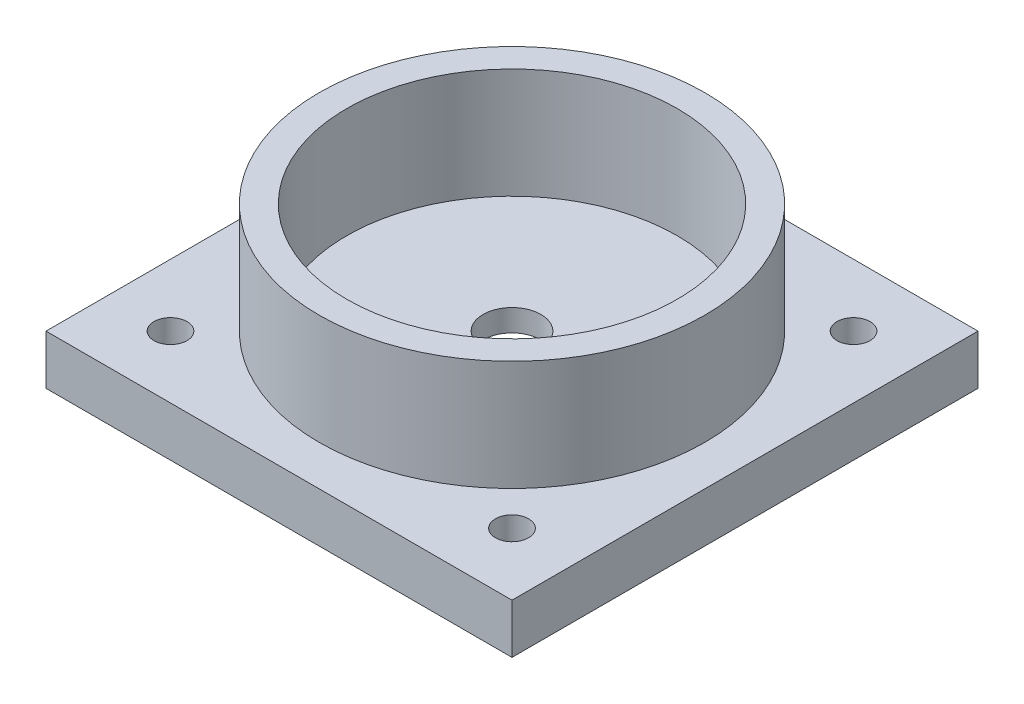
ISO-10303-21;
HEADER;
FILE_DESCRIPTION(('STEP AP214'),'2;1');
FILE_NAME('part.step','',(''),(''),'','','');
FILE_SCHEMA(('AUTOMOTIVE_DESIGN { 1 0 10303 214 1 1 1 1 }'));
ENDSEC;
DATA;
#1=APPLICATION_CONTEXT('core data for automotive mechanical design processes');
#2=APPLICATION_PROTOCOL_DEFINITION('international standard','automotive_design',2000,#1);
#3=PRODUCT_CONTEXT('',#1,'mechanical');
#4=PRODUCT('Part','Part','',(#3));
#5=PRODUCT_RELATED_PRODUCT_CATEGORY('part','',(#4));
#6=PRODUCT_DEFINITION_FORMATION('','',#4);
#7=PRODUCT_DEFINITION_CONTEXT('part definition',#1,'design');
#8=PRODUCT_DEFINITION('design','',#6,#7);
#9=PRODUCT_DEFINITION_SHAPE('','',#8);
#10=(LENGTH_UNIT() NAMED_UNIT(*) SI_UNIT(.MILLI.,.METRE.));
#11=(NAMED_UNIT(*) PLANE_ANGLE_UNIT() SI_UNIT($,.RADIAN.));
#12=(NAMED_UNIT(*) SI_UNIT($,.STERADIAN.) SOLID_ANGLE_UNIT());
#13=UNCERTAINTY_MEASURE_WITH_UNIT(LENGTH_MEASURE(1.E-05),#10,'distance_accuracy_value','');
#14=(GEOMETRIC_REPRESENTATION_CONTEXT(3) GLOBAL_UNCERTAINTY_ASSIGNED_CONTEXT((#13)) GLOBAL_UNIT_ASSIGNED_CONTEXT((#10,
#11,#12)) REPRESENTATION_CONTEXT('',''));
#15=CARTESIAN_POINT('',(0.,0.,0.));
#16=DIRECTION('',(0.,0.,1.));
#17=DIRECTION('',(1.,0.,0.));
#18=AXIS2_PLACEMENT_3D('',#15,#16,#17);
#19=CARTESIAN_POINT('',(0.,4.5,0.));
#20=DIRECTION('',(0.,-1.,0.));
#21=DIRECTION('',(0.,0.,-1.));
#22=AXIS2_PLACEMENT_3D('',#19,#20,#21);
#23=PLANE('',#22);
#24=CARTESIAN_POINT('',(0.,4.5,0.));
#25=DIRECTION('',(0.,-1.,0.));
#26=DIRECTION('',(0.,0.,-1.));
#27=AXIS2_PLACEMENT_3D('',#24,#25,#26);
#28=CIRCLE('',#27,2.625);
#29=CARTESIAN_POINT('',(0.,4.5,-2.625));
#30=VERTEX_POINT('',#29);
#31=EDGE_CURVE('E324',#30,#30,#28,.F.);
#32=ORIENTED_EDGE('',*,*,#31,.F.);
#33=EDGE_LOOP('',(#32));
#34=FACE_BOUND('',#33,.T.);
#35=CARTESIAN_POINT('',(0.,4.5,0.));
#36=DIRECTION('',(0.,1.,0.));
#37=DIRECTION('',(0.,0.,1.));
#38=AXIS2_PLACEMENT_3D('',#35,#36,#37);
#39=CIRCLE('',#38,15.);
#40=CARTESIAN_POINT('',(0.,4.5,15.));
#41=VERTEX_POINT('',#40);
#42=EDGE_CURVE('E335',#41,#41,#39,.T.);
#43=ORIENTED_EDGE('',*,*,#42,.T.);
#44=EDGE_LOOP('',(#43));
#45=FACE_BOUND('',#44,.T.);
#46=ADVANCED_FACE('F36',(#34,#45),#23,.F.);
#47=CARTESIAN_POINT('',(0.,4.5,0.));
#48=DIRECTION('',(0.,-1.,0.));
#49=DIRECTION('',(0.,0.,-1.));
#50=AXIS2_PLACEMENT_3D('',#47,#48,#49);
#51=CIRCLE('',#50,17.5);
#52=CARTESIAN_POINT('',(0.,4.5,-17.5));
#53=VERTEX_POINT('',#52);
#54=EDGE_CURVE('E11',#53,#53,#51,.F.);
#55=ORIENTED_EDGE('',*,*,#54,.F.);
#56=EDGE_LOOP('',(#55));
#57=FACE_BOUND('',#56,.T.);
#58=DIRECTION('',(0.,0.,-1.));
#59=VECTOR('',#58,1.);
#60=CARTESIAN_POINT('',(21.15,4.5,21.15));
#61=LINE('',#60,#59);
#62=CARTESIAN_POINT('',(21.15,4.5,21.15));
#63=VERTEX_POINT('',#62);
#64=CARTESIAN_POINT('',(21.15,4.5,-21.15));
#65=VERTEX_POINT('',#64);
#66=EDGE_CURVE('E90',#63,#65,#61,.T.);
#67=ORIENTED_EDGE('',*,*,#66,.T.);
#68=DIRECTION('',(-1.,0.,0.));
#69=VECTOR('',#68,1.);
#70=CARTESIAN_POINT('',(-21.15,4.5,-21.15));
#71=LINE('',#70,#69);
#72=CARTESIAN_POINT('',(-21.15,4.5,-21.15));
#73=VERTEX_POINT('',#72);
#74=EDGE_CURVE('E84',#65,#73,#71,.T.);
#75=ORIENTED_EDGE('',*,*,#74,.T.);
#76=DIRECTION('',(0.,0.,1.));
#77=VECTOR('',#76,1.);
#78=CARTESIAN_POINT('',(-21.15,4.5,21.15));
#79=LINE('',#78,#77);
#80=CARTESIAN_POINT('',(-21.15,4.5,21.15));
#81=VERTEX_POINT('',#80);
#82=EDGE_CURVE('E88',#73,#81,#79,.T.);
#83=ORIENTED_EDGE('',*,*,#82,.T.);
#84=DIRECTION('',(1.,0.,0.));
#85=VECTOR('',#84,1.);
#86=CARTESIAN_POINT('',(-21.15,4.5,21.15));
#87=LINE('',#86,#85);
#88=EDGE_CURVE('E53',#81,#63,#87,.T.);
#89=ORIENTED_EDGE('',*,*,#88,.T.);
#90=EDGE_LOOP('',(#67,#75,#83,#89));
#91=FACE_BOUND('',#90,.T.);
#92=CARTESIAN_POINT('',(-15.5,4.5,-15.5));
#93=DIRECTION('',(0.,1.,0.));
#94=DIRECTION('',(0.,0.,1.));
#95=AXIS2_PLACEMENT_3D('',#92,#93,#94);
#96=CIRCLE('',#95,1.5);
#97=CARTESIAN_POINT('',(-15.5,4.5,-14.));
#98=VERTEX_POINT('',#97);
#99=EDGE_CURVE('E107',#98,#98,#96,.T.);
#100=ORIENTED_EDGE('',*,*,#99,.F.);
#101=EDGE_LOOP('',(#100));
#102=FACE_BOUND('',#101,.T.);
#103=CARTESIAN_POINT('',(15.5,4.5,-15.5));
#104=DIRECTION('',(0.,1.,0.));
#105=DIRECTION('',(0.,0.,1.));
#106=AXIS2_PLACEMENT_3D('',#103,#104,#105);
#107=CIRCLE('',#106,1.5);
#108=CARTESIAN_POINT('',(15.5,4.5,-14.));
#109=VERTEX_POINT('',#108);
#110=EDGE_CURVE('E144',#109,#109,#107,.T.);
#111=ORIENTED_EDGE('',*,*,#110,.F.);
#112=EDGE_LOOP('',(#111));
#113=FACE_BOUND('',#112,.T.);
#114=CARTESIAN_POINT('',(-15.5,4.5,15.5));
#115=DIRECTION('',(0.,1.,0.));
#116=DIRECTION('',(0.,0.,1.));
#117=AXIS2_PLACEMENT_3D('',#114,#115,#116);
#118=CIRCLE('',#117,1.5);
#119=CARTESIAN_POINT('',(-15.5,4.5,17.));
#120=VERTEX_POINT('',#119);
#121=EDGE_CURVE('E139',#120,#120,#118,.T.);
#122=ORIENTED_EDGE('',*,*,#121,.F.);
#123=EDGE_LOOP('',(#122));
#124=FACE_BOUND('',#123,.T.);
#125=CARTESIAN_POINT('',(15.5,4.5,15.5));
#126=DIRECTION('',(0.,1.,0.));
#127=DIRECTION('',(0.,0.,1.));
#128=AXIS2_PLACEMENT_3D('',#125,#126,#127);
#129=CIRCLE('',#128,1.5);
#130=CARTESIAN_POINT('',(15.5,4.5,17.));
#131=VERTEX_POINT('',#130);
#132=EDGE_CURVE('E128',#131,#131,#129,.T.);
#133=ORIENTED_EDGE('',*,*,#132,.F.);
#134=EDGE_LOOP('',(#133));
#135=FACE_BOUND('',#134,.T.);
#136=ADVANCED_FACE('F85',(#57,#91,#102,#113,#124,#135),#23,.F.);
#137=CARTESIAN_POINT('',(0.,0.,0.));
#138=DIRECTION('',(0.,-1.,0.));
#139=DIRECTION('',(0.,0.,-1.));
#140=AXIS2_PLACEMENT_3D('',#137,#138,#139);
#141=PLANE('',#140);
#142=CARTESIAN_POINT('',(0.,0.,0.));
#143=DIRECTION('',(0.,-1.,0.));
#144=DIRECTION('',(0.,0.,-1.));
#145=AXIS2_PLACEMENT_3D('',#142,#143,#144);
#146=CIRCLE('',#145,11.);
#147=CARTESIAN_POINT('',(0.,0.,-11.));
#148=VERTEX_POINT('',#147);
#149=EDGE_CURVE('E135',#148,#148,#146,.T.);
#150=ORIENTED_EDGE('',*,*,#149,.F.);
#151=EDGE_LOOP('',(#150));
#152=FACE_BOUND('',#151,.T.);
#153=CARTESIAN_POINT('',(-15.5,0.,15.5));
#154=DIRECTION('',(0.,1.,0.));
#155=DIRECTION('',(0.,0.,1.));
#156=AXIS2_PLACEMENT_3D('',#153,#154,#155);
#157=CIRCLE('',#156,1.5);
#158=CARTESIAN_POINT('',(-15.5,0.,17.));
#159=VERTEX_POINT('',#158);
#160=EDGE_CURVE('E132',#159,#159,#157,.T.);
#161=ORIENTED_EDGE('',*,*,#160,.T.);
#162=EDGE_LOOP('',(#161));
#163=FACE_BOUND('',#162,.T.);
#164=CARTESIAN_POINT('',(-15.5,0.,-15.5));
#165=DIRECTION('',(0.,1.,0.));
#166=DIRECTION('',(0.,0.,1.));
#167=AXIS2_PLACEMENT_3D('',#164,#165,#166);
#168=CIRCLE('',#167,1.5);
#169=CARTESIAN_POINT('',(-15.5,0.,-14.));
#170=VERTEX_POINT('',#169);
#171=EDGE_CURVE('E147',#170,#170,#168,.T.);
#172=ORIENTED_EDGE('',*,*,#171,.T.);
#173=EDGE_LOOP('',(#172));
#174=FACE_BOUND('',#173,.T.);
#175=DIRECTION('',(0.,0.,-1.));
#176=VECTOR('',#175,1.);
#177=CARTESIAN_POINT('',(21.15,0.,21.15));
#178=LINE('',#177,#176);
#179=CARTESIAN_POINT('',(21.15,0.,21.15));
#180=VERTEX_POINT('',#179);
#181=CARTESIAN_POINT('',(21.15,0.,-21.15));
#182=VERTEX_POINT('',#181);
#183=EDGE_CURVE('E104',#180,#182,#178,.T.);
#184=ORIENTED_EDGE('',*,*,#183,.F.);
#185=DIRECTION('',(1.,0.,0.));
#186=VECTOR('',#185,1.);
#187=CARTESIAN_POINT('',(-21.15,0.,21.15));
#188=LINE('',#187,#186);
#189=CARTESIAN_POINT('',(-21.15,0.,21.15));
#190=VERTEX_POINT('',#189);
#191=EDGE_CURVE('E76',#190,#180,#188,.T.);
#192=ORIENTED_EDGE('',*,*,#191,.F.);
#193=DIRECTION('',(0.,0.,1.));
#194=VECTOR('',#193,1.);
#195=CARTESIAN_POINT('',(-21.15,0.,21.15));
#196=LINE('',#195,#194);
#197=CARTESIAN_POINT('',(-21.15,0.,-21.15));
#198=VERTEX_POINT('',#197);
#199=EDGE_CURVE('E70',#198,#190,#196,.T.);
#200=ORIENTED_EDGE('',*,*,#199,.F.);
#201=DIRECTION('',(-1.,0.,0.));
#202=VECTOR('',#201,1.);
#203=CARTESIAN_POINT('',(-21.15,0.,-21.15));
#204=LINE('',#203,#202);
#205=EDGE_CURVE('E95',#182,#198,#204,.T.);
#206=ORIENTED_EDGE('',*,*,#205,.F.);
#207=EDGE_LOOP('',(#184,#192,#200,#206));
#208=FACE_BOUND('',#207,.T.);
#209=CARTESIAN_POINT('',(15.5,0.,-15.5));
#210=DIRECTION('',(0.,1.,0.));
#211=DIRECTION('',(0.,0.,1.));
#212=AXIS2_PLACEMENT_3D('',#209,#210,#211);
#213=CIRCLE('',#212,1.5);
#214=CARTESIAN_POINT('',(15.5,0.,-14.));
#215=VERTEX_POINT('',#214);
#216=EDGE_CURVE('E123',#215,#215,#213,.T.);
#217=ORIENTED_EDGE('',*,*,#216,.T.);
#218=EDGE_LOOP('',(#217));
#219=FACE_BOUND('',#218,.T.);
#220=CARTESIAN_POINT('',(15.5,0.,15.5));
#221=DIRECTION('',(0.,1.,0.));
#222=DIRECTION('',(0.,0.,1.));
#223=AXIS2_PLACEMENT_3D('',#220,#221,#222);
#224=CIRCLE('',#223,1.5);
#225=CARTESIAN_POINT('',(15.5,0.,17.));
#226=VERTEX_POINT('',#225);
#227=EDGE_CURVE('E126',#226,#226,#224,.T.);
#228=ORIENTED_EDGE('',*,*,#227,.T.);
#229=EDGE_LOOP('',(#228));
#230=FACE_BOUND('',#229,.T.);
#231=ADVANCED_FACE('F115',(#152,#163,#174,#208,#219,#230),#141,.T.);
#232=CARTESIAN_POINT('',(21.15,4.5,21.15));
#233=DIRECTION('',(-1.,0.,0.));
#234=DIRECTION('',(0.,0.,1.));
#235=AXIS2_PLACEMENT_3D('',#232,#233,#234);
#236=PLANE('',#235);
#237=ORIENTED_EDGE('',*,*,#183,.T.);
#238=DIRECTION('',(0.,-1.,0.));
#239=VECTOR('',#238,1.);
#240=CARTESIAN_POINT('',(21.15,4.5,-21.15));
#241=LINE('',#240,#239);
#242=EDGE_CURVE('E45',#65,#182,#241,.T.);
#243=ORIENTED_EDGE('',*,*,#242,.F.);
#244=ORIENTED_EDGE('',*,*,#66,.F.);
#245=DIRECTION('',(0.,-1.,0.));
#246=VECTOR('',#245,1.);
#247=CARTESIAN_POINT('',(21.15,4.5,21.15));
#248=LINE('',#247,#246);
#249=EDGE_CURVE('E100',#63,#180,#248,.T.);
#250=ORIENTED_EDGE('',*,*,#249,.T.);
#251=EDGE_LOOP('',(#237,#243,#244,#250));
#252=FACE_BOUND('',#251,.T.);
#253=ADVANCED_FACE('F38',(#252),#236,.F.);
#254=CARTESIAN_POINT('',(-21.15,4.5,-21.15));
#255=DIRECTION('',(0.,0.,1.));
#256=DIRECTION('',(1.,0.,0.));
#257=AXIS2_PLACEMENT_3D('',#254,#255,#256);
#258=PLANE('',#257);
#259=ORIENTED_EDGE('',*,*,#205,.T.);
#260=DIRECTION('',(0.,-1.,0.));
#261=VECTOR('',#260,1.);
#262=CARTESIAN_POINT('',(-21.15,4.5,-21.15));
#263=LINE('',#262,#261);
#264=EDGE_CURVE('E93',#73,#198,#263,.T.);
#265=ORIENTED_EDGE('',*,*,#264,.F.);
#266=ORIENTED_EDGE('',*,*,#74,.F.);
#267=ORIENTED_EDGE('',*,*,#242,.T.);
#268=EDGE_LOOP('',(#259,#265,#266,#267));
#269=FACE_BOUND('',#268,.T.);
#270=ADVANCED_FACE('F94',(#269),#258,.F.);
#271=CARTESIAN_POINT('',(-21.15,4.5,21.15));
#272=DIRECTION('',(1.,0.,0.));
#273=DIRECTION('',(0.,0.,-1.));
#274=AXIS2_PLACEMENT_3D('',#271,#272,#273);
#275=PLANE('',#274);
#276=ORIENTED_EDGE('',*,*,#199,.T.);
#277=DIRECTION('',(0.,-1.,0.));
#278=VECTOR('',#277,1.);
#279=CARTESIAN_POINT('',(-21.15,4.5,21.15));
#280=LINE('',#279,#278);
#281=EDGE_CURVE('E96',#81,#190,#280,.T.);
#282=ORIENTED_EDGE('',*,*,#281,.F.);
#283=ORIENTED_EDGE('',*,*,#82,.F.);
#284=ORIENTED_EDGE('',*,*,#264,.T.);
#285=EDGE_LOOP('',(#276,#282,#283,#284));
#286=FACE_BOUND('',#285,.T.);
#287=ADVANCED_FACE('F98',(#286),#275,.F.);
#288=CARTESIAN_POINT('',(-21.15,4.5,21.15));
#289=DIRECTION('',(0.,0.,-1.));
#290=DIRECTION('',(-1.,0.,0.));
#291=AXIS2_PLACEMENT_3D('',#288,#289,#290);
#292=PLANE('',#291);
#293=ORIENTED_EDGE('',*,*,#191,.T.);
#294=ORIENTED_EDGE('',*,*,#249,.F.);
#295=ORIENTED_EDGE('',*,*,#88,.F.);
#296=ORIENTED_EDGE('',*,*,#281,.T.);
#297=EDGE_LOOP('',(#293,#294,#295,#296));
#298=FACE_BOUND('',#297,.T.);
#299=ADVANCED_FACE('F158',(#298),#292,.F.);
#300=CARTESIAN_POINT('',(-15.5,4.5,-15.5));
#301=DIRECTION('',(0.,-1.,0.));
#302=DIRECTION('',(0.,0.,-1.));
#303=AXIS2_PLACEMENT_3D('',#300,#301,#302);
#304=CYLINDRICAL_SURFACE('',#303,1.5);
#305=ORIENTED_EDGE('',*,*,#99,.T.);
#306=EDGE_LOOP('',(#305));
#307=FACE_BOUND('',#306,.T.);
#308=ORIENTED_EDGE('',*,*,#171,.F.);
#309=EDGE_LOOP('',(#308));
#310=FACE_BOUND('',#309,.T.);
#311=ADVANCED_FACE('F155',(#307,#310),#304,.F.);
#312=CARTESIAN_POINT('',(15.5,4.5,-15.5));
#313=DIRECTION('',(0.,-1.,0.));
#314=DIRECTION('',(0.,0.,-1.));
#315=AXIS2_PLACEMENT_3D('',#312,#313,#314);
#316=CYLINDRICAL_SURFACE('',#315,1.5);
#317=ORIENTED_EDGE('',*,*,#110,.T.);
#318=EDGE_LOOP('',(#317));
#319=FACE_BOUND('',#318,.T.);
#320=ORIENTED_EDGE('',*,*,#216,.F.);
#321=EDGE_LOOP('',(#320));
#322=FACE_BOUND('',#321,.T.);
#323=ADVANCED_FACE('F157',(#319,#322),#316,.F.);
#324=CARTESIAN_POINT('',(-15.5,4.5,15.5));
#325=DIRECTION('',(0.,-1.,0.));
#326=DIRECTION('',(0.,0.,-1.));
#327=AXIS2_PLACEMENT_3D('',#324,#325,#326);
#328=CYLINDRICAL_SURFACE('',#327,1.5);
#329=ORIENTED_EDGE('',*,*,#121,.T.);
#330=EDGE_LOOP('',(#329));
#331=FACE_BOUND('',#330,.T.);
#332=ORIENTED_EDGE('',*,*,#160,.F.);
#333=EDGE_LOOP('',(#332));
#334=FACE_BOUND('',#333,.T.);
#335=ADVANCED_FACE('F165',(#331,#334),#328,.F.);
#336=CARTESIAN_POINT('',(15.5,4.5,15.5));
#337=DIRECTION('',(0.,-1.,0.));
#338=DIRECTION('',(0.,0.,-1.));
#339=AXIS2_PLACEMENT_3D('',#336,#337,#338);
#340=CYLINDRICAL_SURFACE('',#339,1.5);
#341=ORIENTED_EDGE('',*,*,#132,.T.);
#342=EDGE_LOOP('',(#341));
#343=FACE_BOUND('',#342,.T.);
#344=ORIENTED_EDGE('',*,*,#227,.F.);
#345=EDGE_LOOP('',(#344));
#346=FACE_BOUND('',#345,.T.);
#347=ADVANCED_FACE('F247',(#343,#346),#340,.F.);
#348=CARTESIAN_POINT('',(0.,2.5,0.));
#349=DIRECTION('',(0.,-1.,0.));
#350=DIRECTION('',(0.,0.,-1.));
#351=AXIS2_PLACEMENT_3D('',#348,#349,#350);
#352=CYLINDRICAL_SURFACE('',#351,11.);
#353=CARTESIAN_POINT('',(0.,2.5,0.));
#354=DIRECTION('',(0.,-1.,0.));
#355=DIRECTION('',(0.,0.,-1.));
#356=AXIS2_PLACEMENT_3D('',#353,#354,#355);
#357=CIRCLE('',#356,11.);
#358=CARTESIAN_POINT('',(0.,2.5,-11.));
#359=VERTEX_POINT('',#358);
#360=EDGE_CURVE('E129',#359,#359,#357,.T.);
#361=ORIENTED_EDGE('',*,*,#360,.F.);
#362=EDGE_LOOP('',(#361));
#363=FACE_BOUND('',#362,.T.);
#364=ORIENTED_EDGE('',*,*,#149,.T.);
#365=EDGE_LOOP('',(#364));
#366=FACE_BOUND('',#365,.T.);
#367=ADVANCED_FACE('F243',(#363,#366),#352,.F.);
#368=CARTESIAN_POINT('',(0.,2.5,0.));
#369=DIRECTION('',(0.,-1.,0.));
#370=DIRECTION('',(0.,0.,-1.));
#371=AXIS2_PLACEMENT_3D('',#368,#369,#370);
#372=PLANE('',#371);
#373=CARTESIAN_POINT('',(0.,2.5,0.));
#374=DIRECTION('',(0.,-1.,0.));
#375=DIRECTION('',(0.,0.,-1.));
#376=AXIS2_PLACEMENT_3D('',#373,#374,#375);
#377=CIRCLE('',#376,2.625);
#378=CARTESIAN_POINT('',(0.,2.5,-2.625));
#379=VERTEX_POINT('',#378);
#380=EDGE_CURVE('E326',#379,#379,#377,.T.);
#381=ORIENTED_EDGE('',*,*,#380,.F.);
#382=EDGE_LOOP('',(#381));
#383=FACE_BOUND('',#382,.T.);
#384=ORIENTED_EDGE('',*,*,#360,.T.);
#385=EDGE_LOOP('',(#384));
#386=FACE_BOUND('',#385,.T.);
#387=ADVANCED_FACE('F239',(#383,#386),#372,.T.);
#388=CARTESIAN_POINT('',(0.,11.9246212024587,0.));
#389=DIRECTION('',(0.,-1.,0.));
#390=DIRECTION('',(0.,0.,-1.));
#391=AXIS2_PLACEMENT_3D('',#388,#389,#390);
#392=CYLINDRICAL_SURFACE('',#391,2.625);
#393=ORIENTED_EDGE('',*,*,#31,.T.);
#394=EDGE_LOOP('',(#393));
#395=FACE_BOUND('',#394,.T.);
#396=ORIENTED_EDGE('',*,*,#380,.T.);
#397=EDGE_LOOP('',(#396));
#398=FACE_BOUND('',#397,.T.);
#399=ADVANCED_FACE('F210',(#395,#398),#392,.F.);
#400=CARTESIAN_POINT('',(0.,14.5,0.));
#401=DIRECTION('',(0.,1.,0.));
#402=DIRECTION('',(0.,0.,1.));
#403=AXIS2_PLACEMENT_3D('',#400,#401,#402);
#404=PLANE('',#403);
#405=CARTESIAN_POINT('',(0.,14.5,0.));
#406=DIRECTION('',(0.,1.,0.));
#407=DIRECTION('',(0.,0.,1.));
#408=AXIS2_PLACEMENT_3D('',#405,#406,#407);
#409=CIRCLE('',#408,17.5);
#410=CARTESIAN_POINT('',(0.,14.5,17.5));
#411=VERTEX_POINT('',#410);
#412=EDGE_CURVE('E331',#411,#411,#409,.T.);
#413=ORIENTED_EDGE('',*,*,#412,.T.);
#414=EDGE_LOOP('',(#413));
#415=FACE_BOUND('',#414,.T.);
#416=CARTESIAN_POINT('',(0.,14.5,0.));
#417=DIRECTION('',(0.,1.,0.));
#418=DIRECTION('',(0.,0.,1.));
#419=AXIS2_PLACEMENT_3D('',#416,#417,#418);
#420=CIRCLE('',#419,15.);
#421=CARTESIAN_POINT('',(0.,14.5,15.));
#422=VERTEX_POINT('',#421);
#423=EDGE_CURVE('E334',#422,#422,#420,.T.);
#424=ORIENTED_EDGE('',*,*,#423,.F.);
#425=EDGE_LOOP('',(#424));
#426=FACE_BOUND('',#425,.T.);
#427=ADVANCED_FACE('F204',(#415,#426),#404,.T.);
#428=CARTESIAN_POINT('',(0.,14.5,0.));
#429=DIRECTION('',(0.,-1.,0.));
#430=DIRECTION('',(0.,0.,-1.));
#431=AXIS2_PLACEMENT_3D('',#428,#429,#430);
#432=CYLINDRICAL_SURFACE('',#431,17.5);
#433=ORIENTED_EDGE('',*,*,#412,.F.);
#434=EDGE_LOOP('',(#433));
#435=FACE_BOUND('',#434,.T.);
#436=ORIENTED_EDGE('',*,*,#54,.T.);
#437=EDGE_LOOP('',(#436));
#438=FACE_BOUND('',#437,.T.);
#439=ADVANCED_FACE('F209',(#435,#438),#432,.T.);
#440=CARTESIAN_POINT('',(0.,14.5,0.));
#441=DIRECTION('',(0.,-1.,0.));
#442=DIRECTION('',(0.,0.,-1.));
#443=AXIS2_PLACEMENT_3D('',#440,#441,#442);
#444=CYLINDRICAL_SURFACE('',#443,15.);
#445=ORIENTED_EDGE('',*,*,#423,.T.);
#446=EDGE_LOOP('',(#445));
#447=FACE_BOUND('',#446,.T.);
#448=ORIENTED_EDGE('',*,*,#42,.F.);
#449=EDGE_LOOP('',(#448));
#450=FACE_BOUND('',#449,.T.);
#451=ADVANCED_FACE('F221',(#447,#450),#444,.F.);
#452=CLOSED_SHELL('',(#46,#136,#231,#253,#270,#287,#299,#311,#323,#335,#347,#367,#387,#399,#427,
#439,#451));
#453=MANIFOLD_SOLID_BREP('B2',#452);
#454=ADVANCED_BREP_SHAPE_REPRESENTATION('',(#18,#453),#14);
#455=SHAPE_DEFINITION_REPRESENTATION(#9,#454);
ENDSEC;
END-ISO-10303-21;
